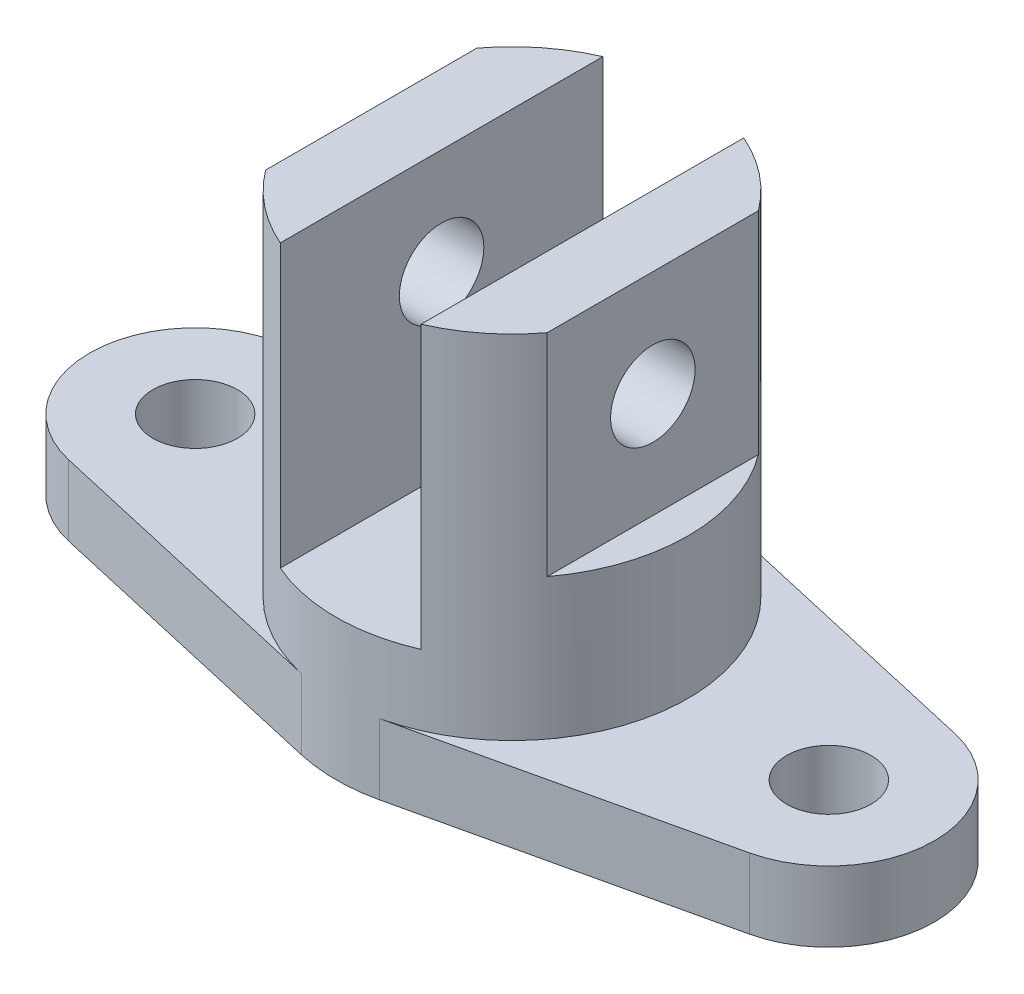
ISO-10303-21;
HEADER;
FILE_DESCRIPTION(('STEP AP214'),'2;1');
FILE_NAME('part.step','',(''),(''),'','','');
FILE_SCHEMA(('AUTOMOTIVE_DESIGN { 1 0 10303 214 1 1 1 1 }'));
ENDSEC;
DATA;
#1=APPLICATION_CONTEXT('core data for automotive mechanical design processes');
#2=APPLICATION_PROTOCOL_DEFINITION('international standard','automotive_design',2000,#1);
#3=PRODUCT_CONTEXT('',#1,'mechanical');
#4=PRODUCT('Part','Part','',(#3));
#5=PRODUCT_RELATED_PRODUCT_CATEGORY('part','',(#4));
#6=PRODUCT_DEFINITION_FORMATION('','',#4);
#7=PRODUCT_DEFINITION_CONTEXT('part definition',#1,'design');
#8=PRODUCT_DEFINITION('design','',#6,#7);
#9=PRODUCT_DEFINITION_SHAPE('','',#8);
#10=(LENGTH_UNIT() NAMED_UNIT(*) SI_UNIT(.MILLI.,.METRE.));
#11=(NAMED_UNIT(*) PLANE_ANGLE_UNIT() SI_UNIT($,.RADIAN.));
#12=(NAMED_UNIT(*) SI_UNIT($,.STERADIAN.) SOLID_ANGLE_UNIT());
#13=UNCERTAINTY_MEASURE_WITH_UNIT(LENGTH_MEASURE(1.E-05),#10,'distance_accuracy_value','');
#14=(GEOMETRIC_REPRESENTATION_CONTEXT(3) GLOBAL_UNCERTAINTY_ASSIGNED_CONTEXT((#13)) GLOBAL_UNIT_ASSIGNED_CONTEXT((#10,
#11,#12)) REPRESENTATION_CONTEXT('',''));
#15=CARTESIAN_POINT('',(0.,0.,0.));
#16=DIRECTION('',(0.,0.,1.));
#17=DIRECTION('',(1.,0.,0.));
#18=AXIS2_PLACEMENT_3D('',#15,#16,#17);
#19=CARTESIAN_POINT('',(0.,60.,0.));
#20=DIRECTION('',(0.,1.,0.));
#21=DIRECTION('',(0.,0.,1.));
#22=AXIS2_PLACEMENT_3D('',#19,#20,#21);
#23=PLANE('',#22);
#24=DIRECTION('',(0.,0.,1.));
#25=VECTOR('',#24,1.);
#26=CARTESIAN_POINT('',(20.,60.,-25.));
#27=LINE('',#26,#25);
#28=CARTESIAN_POINT('',(20.,60.,-15.));
#29=VERTEX_POINT('',#28);
#30=CARTESIAN_POINT('',(20.,60.,15.));
#31=VERTEX_POINT('',#30);
#32=EDGE_CURVE('E259',#29,#31,#27,.T.);
#33=ORIENTED_EDGE('',*,*,#32,.F.);
#34=CARTESIAN_POINT('',(0.,60.,0.));
#35=DIRECTION('',(0.,1.,0.));
#36=DIRECTION('',(0.,0.,1.));
#37=AXIS2_PLACEMENT_3D('',#34,#35,#36);
#38=CIRCLE('',#37,25.);
#39=CARTESIAN_POINT('',(10.,60.,-22.9128784747792));
#40=VERTEX_POINT('',#39);
#41=EDGE_CURVE('E182',#29,#40,#38,.T.);
#42=ORIENTED_EDGE('',*,*,#41,.T.);
#43=DIRECTION('',(0.,0.,-1.));
#44=VECTOR('',#43,1.);
#45=CARTESIAN_POINT('',(10.,60.,0.));
#46=LINE('',#45,#44);
#47=CARTESIAN_POINT('',(10.,60.,22.9128784747792));
#48=VERTEX_POINT('',#47);
#49=EDGE_CURVE('E237',#48,#40,#46,.T.);
#50=ORIENTED_EDGE('',*,*,#49,.F.);
#51=EDGE_CURVE('E185',#48,#31,#38,.T.);
#52=ORIENTED_EDGE('',*,*,#51,.T.);
#53=EDGE_LOOP('',(#33,#42,#50,#52));
#54=FACE_BOUND('',#53,.T.);
#55=ADVANCED_FACE('F44',(#54),#23,.T.);
#56=CARTESIAN_POINT('',(5.55555555555555,10.,24.3749010760892));
#57=DIRECTION('',(0.222222222222222,0.,0.974996043043569));
#58=DIRECTION('',(0.974996043043569,0.,-0.222222222222222));
#59=AXIS2_PLACEMENT_3D('',#56,#57,#58);
#60=PLANE('',#59);
#61=DIRECTION('',(-0.974996043043569,0.,0.222222222222222));
#62=VECTOR('',#61,1.);
#63=CARTESIAN_POINT('',(5.55555555555555,0.,24.3749010760892));
#64=LINE('',#63,#62);
#65=CARTESIAN_POINT('',(48.3333333333333,0.,14.6249406456535));
#66=VERTEX_POINT('',#65);
#67=CARTESIAN_POINT('',(5.55555555555555,0.,24.3749010760892));
#68=VERTEX_POINT('',#67);
#69=EDGE_CURVE('E200',#66,#68,#64,.T.);
#70=ORIENTED_EDGE('',*,*,#69,.F.);
#71=DIRECTION('',(0.,-1.,0.));
#72=VECTOR('',#71,1.);
#73=CARTESIAN_POINT('',(48.3333333333333,10.,14.6249406456535));
#74=LINE('',#73,#72);
#75=CARTESIAN_POINT('',(48.3333333333333,10.,14.6249406456535));
#76=VERTEX_POINT('',#75);
#77=EDGE_CURVE('E232',#76,#66,#74,.T.);
#78=ORIENTED_EDGE('',*,*,#77,.F.);
#79=DIRECTION('',(-0.974996043043569,0.,0.222222222222222));
#80=VECTOR('',#79,1.);
#81=CARTESIAN_POINT('',(5.55555555555555,10.,24.3749010760892));
#82=LINE('',#81,#80);
#83=CARTESIAN_POINT('',(5.55555555555555,10.,24.3749010760892));
#84=VERTEX_POINT('',#83);
#85=EDGE_CURVE('E351',#76,#84,#82,.T.);
#86=ORIENTED_EDGE('',*,*,#85,.T.);
#87=DIRECTION('',(0.,-1.,0.));
#88=VECTOR('',#87,1.);
#89=CARTESIAN_POINT('',(5.55555555555555,10.,24.3749010760892));
#90=LINE('',#89,#88);
#91=EDGE_CURVE('E220',#84,#68,#90,.T.);
#92=ORIENTED_EDGE('',*,*,#91,.T.);
#93=EDGE_LOOP('',(#70,#78,#86,#92));
#94=FACE_BOUND('',#93,.T.);
#95=ADVANCED_FACE('F371',(#94),#60,.T.);
#96=CARTESIAN_POINT('',(45.,10.,0.));
#97=DIRECTION('',(0.,-1.,0.));
#98=DIRECTION('',(0.,0.,-1.));
#99=AXIS2_PLACEMENT_3D('',#96,#97,#98);
#100=CYLINDRICAL_SURFACE('',#99,15.);
#101=CARTESIAN_POINT('',(45.,0.,0.));
#102=DIRECTION('',(0.,1.,0.));
#103=DIRECTION('',(0.,0.,1.));
#104=AXIS2_PLACEMENT_3D('',#101,#102,#103);
#105=CIRCLE('',#104,15.);
#106=CARTESIAN_POINT('',(48.3333333333333,0.,-14.6249406456535));
#107=VERTEX_POINT('',#106);
#108=EDGE_CURVE('E206',#66,#107,#105,.T.);
#109=ORIENTED_EDGE('',*,*,#108,.T.);
#110=DIRECTION('',(0.,-1.,0.));
#111=VECTOR('',#110,1.);
#112=CARTESIAN_POINT('',(48.3333333333333,10.,-14.6249406456535));
#113=LINE('',#112,#111);
#114=CARTESIAN_POINT('',(48.3333333333333,10.,-14.6249406456535));
#115=VERTEX_POINT('',#114);
#116=EDGE_CURVE('E228',#115,#107,#113,.T.);
#117=ORIENTED_EDGE('',*,*,#116,.F.);
#118=CARTESIAN_POINT('',(45.,10.,0.));
#119=DIRECTION('',(0.,1.,0.));
#120=DIRECTION('',(0.,0.,1.));
#121=AXIS2_PLACEMENT_3D('',#118,#119,#120);
#122=CIRCLE('',#121,15.);
#123=EDGE_CURVE('E355',#76,#115,#122,.T.);
#124=ORIENTED_EDGE('',*,*,#123,.F.);
#125=ORIENTED_EDGE('',*,*,#77,.T.);
#126=EDGE_LOOP('',(#109,#117,#124,#125));
#127=FACE_BOUND('',#126,.T.);
#128=ADVANCED_FACE('F374',(#127),#100,.T.);
#129=CARTESIAN_POINT('',(5.55555555555555,10.,-24.3749010760892));
#130=DIRECTION('',(-0.222222222222222,0.,0.974996043043569));
#131=DIRECTION('',(0.974996043043569,0.,0.222222222222222));
#132=AXIS2_PLACEMENT_3D('',#129,#130,#131);
#133=PLANE('',#132);
#134=DIRECTION('',(-0.974996043043569,0.,-0.222222222222222));
#135=VECTOR('',#134,1.);
#136=CARTESIAN_POINT('',(5.55555555555555,0.,-24.3749010760892));
#137=LINE('',#136,#135);
#138=CARTESIAN_POINT('',(5.55555555555556,0.,-24.3749010760892));
#139=VERTEX_POINT('',#138);
#140=EDGE_CURVE('E215',#107,#139,#137,.T.);
#141=ORIENTED_EDGE('',*,*,#140,.T.);
#142=DIRECTION('',(0.,-1.,0.));
#143=VECTOR('',#142,1.);
#144=CARTESIAN_POINT('',(5.55555555555556,10.,-24.3749010760892));
#145=LINE('',#144,#143);
#146=CARTESIAN_POINT('',(5.55555555555555,10.,-24.3749010760892));
#147=VERTEX_POINT('',#146);
#148=EDGE_CURVE('E224',#147,#139,#145,.T.);
#149=ORIENTED_EDGE('',*,*,#148,.F.);
#150=DIRECTION('',(-0.974996043043569,0.,-0.222222222222222));
#151=VECTOR('',#150,1.);
#152=CARTESIAN_POINT('',(5.55555555555555,10.,-24.3749010760892));
#153=LINE('',#152,#151);
#154=EDGE_CURVE('E358',#115,#147,#153,.T.);
#155=ORIENTED_EDGE('',*,*,#154,.F.);
#156=ORIENTED_EDGE('',*,*,#116,.T.);
#157=EDGE_LOOP('',(#141,#149,#155,#156));
#158=FACE_BOUND('',#157,.T.);
#159=ADVANCED_FACE('F376',(#158),#133,.F.);
#160=CARTESIAN_POINT('',(45.,10.,0.));
#161=DIRECTION('',(0.,-1.,0.));
#162=DIRECTION('',(0.,0.,-1.));
#163=AXIS2_PLACEMENT_3D('',#160,#161,#162);
#164=CYLINDRICAL_SURFACE('',#163,6.);
#165=CARTESIAN_POINT('',(45.,10.,0.));
#166=DIRECTION('',(0.,1.,0.));
#167=DIRECTION('',(0.,0.,1.));
#168=AXIS2_PLACEMENT_3D('',#165,#166,#167);
#169=CIRCLE('',#168,6.);
#170=CARTESIAN_POINT('',(45.,10.,6.00000000000001));
#171=VERTEX_POINT('',#170);
#172=EDGE_CURVE('E219',#171,#171,#169,.F.);
#173=ORIENTED_EDGE('',*,*,#172,.F.);
#174=EDGE_LOOP('',(#173));
#175=FACE_BOUND('',#174,.T.);
#176=CARTESIAN_POINT('',(45.,0.,0.));
#177=DIRECTION('',(0.,1.,0.));
#178=DIRECTION('',(0.,0.,1.));
#179=AXIS2_PLACEMENT_3D('',#176,#177,#178);
#180=CIRCLE('',#179,6.);
#181=CARTESIAN_POINT('',(45.,0.,6.00000000000001));
#182=VERTEX_POINT('',#181);
#183=EDGE_CURVE('E193',#182,#182,#180,.F.);
#184=ORIENTED_EDGE('',*,*,#183,.T.);
#185=EDGE_LOOP('',(#184));
#186=FACE_BOUND('',#185,.T.);
#187=ADVANCED_FACE('F46',(#175,#186),#164,.F.);
#188=CARTESIAN_POINT('',(0.,10.,0.));
#189=DIRECTION('',(0.,1.,0.));
#190=DIRECTION('',(0.,0.,1.));
#191=AXIS2_PLACEMENT_3D('',#188,#189,#190);
#192=PLANE('',#191);
#193=ORIENTED_EDGE('',*,*,#172,.T.);
#194=EDGE_LOOP('',(#193));
#195=FACE_BOUND('',#194,.T.);
#196=ORIENTED_EDGE('',*,*,#85,.F.);
#197=ORIENTED_EDGE('',*,*,#123,.T.);
#198=ORIENTED_EDGE('',*,*,#154,.T.);
#199=CARTESIAN_POINT('',(0.,10.,0.));
#200=DIRECTION('',(0.,1.,0.));
#201=DIRECTION('',(0.,0.,1.));
#202=AXIS2_PLACEMENT_3D('',#199,#200,#201);
#203=CIRCLE('',#202,25.);
#204=EDGE_CURVE('E209',#84,#147,#203,.T.);
#205=ORIENTED_EDGE('',*,*,#204,.F.);
#206=EDGE_LOOP('',(#196,#197,#198,#205));
#207=FACE_BOUND('',#206,.T.);
#208=ADVANCED_FACE('F366',(#195,#207),#192,.T.);
#209=CARTESIAN_POINT('',(0.,0.,0.));
#210=DIRECTION('',(0.,1.,0.));
#211=DIRECTION('',(0.,0.,1.));
#212=AXIS2_PLACEMENT_3D('',#209,#210,#211);
#213=PLANE('',#212);
#214=ORIENTED_EDGE('',*,*,#183,.F.);
#215=EDGE_LOOP('',(#214));
#216=FACE_BOUND('',#215,.T.);
#217=ORIENTED_EDGE('',*,*,#69,.T.);
#218=CARTESIAN_POINT('',(0.,0.,0.));
#219=DIRECTION('',(0.,1.,0.));
#220=DIRECTION('',(0.,0.,1.));
#221=AXIS2_PLACEMENT_3D('',#218,#219,#220);
#222=CIRCLE('',#221,25.);
#223=CARTESIAN_POINT('',(-5.55555555555555,0.,24.3749010760892));
#224=VERTEX_POINT('',#223);
#225=EDGE_CURVE('E341',#224,#68,#222,.T.);
#226=ORIENTED_EDGE('',*,*,#225,.F.);
#227=DIRECTION('',(0.974996043043569,0.,0.222222222222222));
#228=VECTOR('',#227,1.);
#229=CARTESIAN_POINT('',(-5.55555555555555,0.,24.3749010760892));
#230=LINE('',#229,#228);
#231=CARTESIAN_POINT('',(-48.3333333333333,0.,14.6249406456535));
#232=VERTEX_POINT('',#231);
#233=EDGE_CURVE('E319',#232,#224,#230,.T.);
#234=ORIENTED_EDGE('',*,*,#233,.F.);
#235=CARTESIAN_POINT('',(-45.,0.,0.));
#236=DIRECTION('',(0.,1.,0.));
#237=DIRECTION('',(0.,0.,1.));
#238=AXIS2_PLACEMENT_3D('',#235,#236,#237);
#239=CIRCLE('',#238,15.);
#240=CARTESIAN_POINT('',(-48.3333333333333,0.,-14.6249406456535));
#241=VERTEX_POINT('',#240);
#242=EDGE_CURVE('E294',#232,#241,#239,.F.);
#243=ORIENTED_EDGE('',*,*,#242,.T.);
#244=DIRECTION('',(0.974996043043569,0.,-0.222222222222222));
#245=VECTOR('',#244,1.);
#246=CARTESIAN_POINT('',(-5.55555555555555,0.,-24.3749010760892));
#247=LINE('',#246,#245);
#248=CARTESIAN_POINT('',(-5.55555555555555,0.,-24.3749010760892));
#249=VERTEX_POINT('',#248);
#250=EDGE_CURVE('E323',#241,#249,#247,.T.);
#251=ORIENTED_EDGE('',*,*,#250,.T.);
#252=EDGE_CURVE('E188',#139,#249,#222,.T.);
#253=ORIENTED_EDGE('',*,*,#252,.F.);
#254=ORIENTED_EDGE('',*,*,#140,.F.);
#255=ORIENTED_EDGE('',*,*,#108,.F.);
#256=EDGE_LOOP('',(#217,#226,#234,#243,#251,#253,#254,#255));
#257=FACE_BOUND('',#256,.T.);
#258=CARTESIAN_POINT('',(-45.,0.,0.));
#259=DIRECTION('',(0.,1.,0.));
#260=DIRECTION('',(0.,0.,1.));
#261=AXIS2_PLACEMENT_3D('',#258,#259,#260);
#262=CIRCLE('',#261,6.);
#263=CARTESIAN_POINT('',(-45.,0.,6.00000000000001));
#264=VERTEX_POINT('',#263);
#265=EDGE_CURVE('E300',#264,#264,#262,.T.);
#266=ORIENTED_EDGE('',*,*,#265,.T.);
#267=EDGE_LOOP('',(#266));
#268=FACE_BOUND('',#267,.T.);
#269=ADVANCED_FACE('F378',(#216,#257,#268),#213,.F.);
#270=CARTESIAN_POINT('',(0.,60.,0.));
#271=DIRECTION('',(0.,-1.,0.));
#272=DIRECTION('',(0.,0.,-1.));
#273=AXIS2_PLACEMENT_3D('',#270,#271,#272);
#274=CYLINDRICAL_SURFACE('',#273,25.);
#275=CARTESIAN_POINT('',(-20.,60.,15.));
#276=VERTEX_POINT('',#275);
#277=CARTESIAN_POINT('',(-10.,60.,22.9128784747792));
#278=VERTEX_POINT('',#277);
#279=EDGE_CURVE('E183',#276,#278,#38,.T.);
#280=ORIENTED_EDGE('',*,*,#279,.F.);
#281=DIRECTION('',(0.,-1.,0.));
#282=VECTOR('',#281,1.);
#283=CARTESIAN_POINT('',(-20.,60.,15.));
#284=LINE('',#283,#282);
#285=CARTESIAN_POINT('',(-20.,30.,15.));
#286=VERTEX_POINT('',#285);
#287=EDGE_CURVE('E61',#276,#286,#284,.T.);
#288=ORIENTED_EDGE('',*,*,#287,.T.);
#289=CARTESIAN_POINT('',(0.,30.,0.));
#290=DIRECTION('',(0.,-1.,0.));
#291=DIRECTION('',(0.,0.,-1.));
#292=AXIS2_PLACEMENT_3D('',#289,#290,#291);
#293=CIRCLE('',#292,25.);
#294=CARTESIAN_POINT('',(-20.,30.,-15.));
#295=VERTEX_POINT('',#294);
#296=EDGE_CURVE('E11',#286,#295,#293,.T.);
#297=ORIENTED_EDGE('',*,*,#296,.T.);
#298=DIRECTION('',(0.,-1.,0.));
#299=VECTOR('',#298,1.);
#300=CARTESIAN_POINT('',(-20.,60.,-15.));
#301=LINE('',#300,#299);
#302=CARTESIAN_POINT('',(-20.,60.,-15.));
#303=VERTEX_POINT('',#302);
#304=EDGE_CURVE('E162',#295,#303,#301,.F.);
#305=ORIENTED_EDGE('',*,*,#304,.T.);
#306=CARTESIAN_POINT('',(-10.,60.,-22.9128784747792));
#307=VERTEX_POINT('',#306);
#308=EDGE_CURVE('E175',#307,#303,#38,.T.);
#309=ORIENTED_EDGE('',*,*,#308,.F.);
#310=DIRECTION('',(0.,-1.,0.));
#311=VECTOR('',#310,1.);
#312=CARTESIAN_POINT('',(-10.,60.,-22.9128784747792));
#313=LINE('',#312,#311);
#314=CARTESIAN_POINT('',(-10.,20.,-22.9128784747792));
#315=VERTEX_POINT('',#314);
#316=EDGE_CURVE('E69',#307,#315,#313,.T.);
#317=ORIENTED_EDGE('',*,*,#316,.T.);
#318=CARTESIAN_POINT('',(0.,20.,0.));
#319=DIRECTION('',(0.,-1.,0.));
#320=DIRECTION('',(0.,0.,-1.));
#321=AXIS2_PLACEMENT_3D('',#318,#319,#320);
#322=CIRCLE('',#321,25.);
#323=CARTESIAN_POINT('',(10.,20.,-22.9128784747792));
#324=VERTEX_POINT('',#323);
#325=EDGE_CURVE('E241',#315,#324,#322,.T.);
#326=ORIENTED_EDGE('',*,*,#325,.T.);
#327=DIRECTION('',(0.,-1.,0.));
#328=VECTOR('',#327,1.);
#329=CARTESIAN_POINT('',(10.,60.,-22.9128784747792));
#330=LINE('',#329,#328);
#331=EDGE_CURVE('E287',#324,#40,#330,.F.);
#332=ORIENTED_EDGE('',*,*,#331,.T.);
#333=ORIENTED_EDGE('',*,*,#41,.F.);
#334=DIRECTION('',(0.,-1.,0.));
#335=VECTOR('',#334,1.);
#336=CARTESIAN_POINT('',(20.,60.,-15.));
#337=LINE('',#336,#335);
#338=CARTESIAN_POINT('',(20.,30.,-15.));
#339=VERTEX_POINT('',#338);
#340=EDGE_CURVE('E54',#29,#339,#337,.T.);
#341=ORIENTED_EDGE('',*,*,#340,.T.);
#342=CARTESIAN_POINT('',(0.,30.,0.));
#343=DIRECTION('',(0.,1.,0.));
#344=DIRECTION('',(0.,0.,1.));
#345=AXIS2_PLACEMENT_3D('',#342,#343,#344);
#346=CIRCLE('',#345,25.);
#347=CARTESIAN_POINT('',(20.,30.,15.));
#348=VERTEX_POINT('',#347);
#349=EDGE_CURVE('E168',#348,#339,#346,.T.);
#350=ORIENTED_EDGE('',*,*,#349,.F.);
#351=DIRECTION('',(0.,-1.,0.));
#352=VECTOR('',#351,1.);
#353=CARTESIAN_POINT('',(20.,60.,15.));
#354=LINE('',#353,#352);
#355=EDGE_CURVE('E247',#348,#31,#354,.F.);
#356=ORIENTED_EDGE('',*,*,#355,.T.);
#357=ORIENTED_EDGE('',*,*,#51,.F.);
#358=DIRECTION('',(0.,-1.,0.));
#359=VECTOR('',#358,1.);
#360=CARTESIAN_POINT('',(10.,60.,22.9128784747792));
#361=LINE('',#360,#359);
#362=CARTESIAN_POINT('',(10.,20.,22.9128784747792));
#363=VERTEX_POINT('',#362);
#364=EDGE_CURVE('E290',#48,#363,#361,.T.);
#365=ORIENTED_EDGE('',*,*,#364,.T.);
#366=CARTESIAN_POINT('',(-10.,20.,22.9128784747792));
#367=VERTEX_POINT('',#366);
#368=EDGE_CURVE('E169',#363,#367,#322,.T.);
#369=ORIENTED_EDGE('',*,*,#368,.T.);
#370=DIRECTION('',(0.,-1.,0.));
#371=VECTOR('',#370,1.);
#372=CARTESIAN_POINT('',(-10.,60.,22.9128784747792));
#373=LINE('',#372,#371);
#374=EDGE_CURVE('E281',#367,#278,#373,.F.);
#375=ORIENTED_EDGE('',*,*,#374,.T.);
#376=EDGE_LOOP('',(#280,#288,#297,#305,#309,#317,#326,#332,#333,#341,#350,#356,#357,#365,#369,#375));
#377=FACE_BOUND('',#376,.T.);
#378=CARTESIAN_POINT('',(0.,10.,0.));
#379=DIRECTION('',(0.,1.,0.));
#380=DIRECTION('',(0.,0.,1.));
#381=AXIS2_PLACEMENT_3D('',#378,#379,#380);
#382=CIRCLE('',#381,25.);
#383=CARTESIAN_POINT('',(-5.55555555555556,10.,-24.3749010760892));
#384=VERTEX_POINT('',#383);
#385=CARTESIAN_POINT('',(-5.55555555555555,10.,24.3749010760892));
#386=VERTEX_POINT('',#385);
#387=EDGE_CURVE('E304',#384,#386,#382,.T.);
#388=ORIENTED_EDGE('',*,*,#387,.T.);
#389=DIRECTION('',(0.,-1.,0.));
#390=VECTOR('',#389,1.);
#391=CARTESIAN_POINT('',(-5.55555555555555,10.,24.3749010760892));
#392=LINE('',#391,#390);
#393=EDGE_CURVE('E336',#386,#224,#392,.T.);
#394=ORIENTED_EDGE('',*,*,#393,.T.);
#395=ORIENTED_EDGE('',*,*,#225,.T.);
#396=ORIENTED_EDGE('',*,*,#91,.F.);
#397=ORIENTED_EDGE('',*,*,#204,.T.);
#398=ORIENTED_EDGE('',*,*,#148,.T.);
#399=ORIENTED_EDGE('',*,*,#252,.T.);
#400=DIRECTION('',(0.,-1.,0.));
#401=VECTOR('',#400,1.);
#402=CARTESIAN_POINT('',(-5.55555555555556,10.,-24.3749010760892));
#403=LINE('',#402,#401);
#404=EDGE_CURVE('E332',#384,#249,#403,.T.);
#405=ORIENTED_EDGE('',*,*,#404,.F.);
#406=EDGE_LOOP('',(#388,#394,#395,#396,#397,#398,#399,#405));
#407=FACE_BOUND('',#406,.T.);
#408=ADVANCED_FACE('F173',(#377,#407),#274,.T.);
#409=DIRECTION('',(0.,0.,-1.));
#410=VECTOR('',#409,1.);
#411=CARTESIAN_POINT('',(-20.,60.,0.));
#412=LINE('',#411,#410);
#413=EDGE_CURVE('E159',#276,#303,#412,.T.);
#414=ORIENTED_EDGE('',*,*,#413,.F.);
#415=ORIENTED_EDGE('',*,*,#279,.T.);
#416=DIRECTION('',(0.,0.,1.));
#417=VECTOR('',#416,1.);
#418=CARTESIAN_POINT('',(-10.,60.,0.));
#419=LINE('',#418,#417);
#420=EDGE_CURVE('E180',#307,#278,#419,.T.);
#421=ORIENTED_EDGE('',*,*,#420,.F.);
#422=ORIENTED_EDGE('',*,*,#308,.T.);
#423=EDGE_LOOP('',(#414,#415,#421,#422));
#424=FACE_BOUND('',#423,.T.);
#425=ADVANCED_FACE('F179',(#424),#23,.T.);
#426=CARTESIAN_POINT('',(-45.,10.,0.));
#427=DIRECTION('',(0.,-1.,0.));
#428=DIRECTION('',(0.,0.,-1.));
#429=AXIS2_PLACEMENT_3D('',#426,#427,#428);
#430=CYLINDRICAL_SURFACE('',#429,15.);
#431=ORIENTED_EDGE('',*,*,#242,.F.);
#432=DIRECTION('',(0.,-1.,0.));
#433=VECTOR('',#432,1.);
#434=CARTESIAN_POINT('',(-48.3333333333333,10.,14.6249406456535));
#435=LINE('',#434,#433);
#436=CARTESIAN_POINT('',(-48.3333333333333,10.,14.6249406456535));
#437=VERTEX_POINT('',#436);
#438=EDGE_CURVE('E339',#437,#232,#435,.T.);
#439=ORIENTED_EDGE('',*,*,#438,.F.);
#440=CARTESIAN_POINT('',(-45.,10.,0.));
#441=DIRECTION('',(0.,1.,0.));
#442=DIRECTION('',(0.,0.,1.));
#443=AXIS2_PLACEMENT_3D('',#440,#441,#442);
#444=CIRCLE('',#443,15.);
#445=CARTESIAN_POINT('',(-48.3333333333333,10.,-14.6249406456535));
#446=VERTEX_POINT('',#445);
#447=EDGE_CURVE('E295',#437,#446,#444,.F.);
#448=ORIENTED_EDGE('',*,*,#447,.T.);
#449=DIRECTION('',(0.,-1.,0.));
#450=VECTOR('',#449,1.);
#451=CARTESIAN_POINT('',(-48.3333333333333,10.,-14.6249406456535));
#452=LINE('',#451,#450);
#453=EDGE_CURVE('E315',#446,#241,#452,.T.);
#454=ORIENTED_EDGE('',*,*,#453,.T.);
#455=EDGE_LOOP('',(#431,#439,#448,#454));
#456=FACE_BOUND('',#455,.T.);
#457=ADVANCED_FACE('F393',(#456),#430,.T.);
#458=CARTESIAN_POINT('',(-5.55555555555555,10.,24.3749010760892));
#459=DIRECTION('',(0.222222222222222,0.,-0.974996043043569));
#460=DIRECTION('',(-0.974996043043569,0.,-0.222222222222222));
#461=AXIS2_PLACEMENT_3D('',#458,#459,#460);
#462=PLANE('',#461);
#463=ORIENTED_EDGE('',*,*,#233,.T.);
#464=ORIENTED_EDGE('',*,*,#393,.F.);
#465=DIRECTION('',(0.974996043043569,0.,0.222222222222222));
#466=VECTOR('',#465,1.);
#467=CARTESIAN_POINT('',(-5.55555555555555,10.,24.3749010760892));
#468=LINE('',#467,#466);
#469=EDGE_CURVE('E299',#437,#386,#468,.T.);
#470=ORIENTED_EDGE('',*,*,#469,.F.);
#471=ORIENTED_EDGE('',*,*,#438,.T.);
#472=EDGE_LOOP('',(#463,#464,#470,#471));
#473=FACE_BOUND('',#472,.T.);
#474=ADVANCED_FACE('F390',(#473),#462,.F.);
#475=CARTESIAN_POINT('',(-5.55555555555555,10.,-24.3749010760892));
#476=DIRECTION('',(-0.222222222222222,0.,-0.974996043043569));
#477=DIRECTION('',(-0.974996043043569,0.,0.222222222222222));
#478=AXIS2_PLACEMENT_3D('',#475,#476,#477);
#479=PLANE('',#478);
#480=ORIENTED_EDGE('',*,*,#250,.F.);
#481=ORIENTED_EDGE('',*,*,#453,.F.);
#482=DIRECTION('',(0.974996043043569,0.,-0.222222222222222));
#483=VECTOR('',#482,1.);
#484=CARTESIAN_POINT('',(-5.55555555555555,10.,-24.3749010760892));
#485=LINE('',#484,#483);
#486=EDGE_CURVE('E307',#446,#384,#485,.T.);
#487=ORIENTED_EDGE('',*,*,#486,.T.);
#488=ORIENTED_EDGE('',*,*,#404,.T.);
#489=EDGE_LOOP('',(#480,#481,#487,#488));
#490=FACE_BOUND('',#489,.T.);
#491=ADVANCED_FACE('F383',(#490),#479,.T.);
#492=CARTESIAN_POINT('',(-45.,10.,0.));
#493=DIRECTION('',(0.,-1.,0.));
#494=DIRECTION('',(0.,0.,-1.));
#495=AXIS2_PLACEMENT_3D('',#492,#493,#494);
#496=CYLINDRICAL_SURFACE('',#495,6.);
#497=CARTESIAN_POINT('',(-45.,10.,0.));
#498=DIRECTION('',(0.,1.,0.));
#499=DIRECTION('',(0.,0.,1.));
#500=AXIS2_PLACEMENT_3D('',#497,#498,#499);
#501=CIRCLE('',#500,6.);
#502=CARTESIAN_POINT('',(-45.,10.,6.00000000000001));
#503=VERTEX_POINT('',#502);
#504=EDGE_CURVE('E311',#503,#503,#501,.T.);
#505=ORIENTED_EDGE('',*,*,#504,.T.);
#506=EDGE_LOOP('',(#505));
#507=FACE_BOUND('',#506,.T.);
#508=ORIENTED_EDGE('',*,*,#265,.F.);
#509=EDGE_LOOP('',(#508));
#510=FACE_BOUND('',#509,.T.);
#511=ADVANCED_FACE('F566',(#507,#510),#496,.F.);
#512=CARTESIAN_POINT('',(0.,10.,0.));
#513=DIRECTION('',(0.,1.,0.));
#514=DIRECTION('',(0.,0.,1.));
#515=AXIS2_PLACEMENT_3D('',#512,#513,#514);
#516=PLANE('',#515);
#517=ORIENTED_EDGE('',*,*,#447,.F.);
#518=ORIENTED_EDGE('',*,*,#469,.T.);
#519=ORIENTED_EDGE('',*,*,#387,.F.);
#520=ORIENTED_EDGE('',*,*,#486,.F.);
#521=EDGE_LOOP('',(#517,#518,#519,#520));
#522=FACE_BOUND('',#521,.T.);
#523=ORIENTED_EDGE('',*,*,#504,.F.);
#524=EDGE_LOOP('',(#523));
#525=FACE_BOUND('',#524,.T.);
#526=ADVANCED_FACE('F387',(#522,#525),#516,.T.);
#527=CARTESIAN_POINT('',(0.,20.,0.));
#528=DIRECTION('',(0.,-1.,0.));
#529=DIRECTION('',(0.,0.,-1.));
#530=AXIS2_PLACEMENT_3D('',#527,#528,#529);
#531=PLANE('',#530);
#532=DIRECTION('',(0.,0.,-1.));
#533=VECTOR('',#532,1.);
#534=CARTESIAN_POINT('',(10.,20.,28.3162679529388));
#535=LINE('',#534,#533);
#536=EDGE_CURVE('E273',#363,#324,#535,.T.);
#537=ORIENTED_EDGE('',*,*,#536,.T.);
#538=ORIENTED_EDGE('',*,*,#325,.F.);
#539=DIRECTION('',(0.,0.,1.));
#540=VECTOR('',#539,1.);
#541=CARTESIAN_POINT('',(-10.,20.,28.3162679529388));
#542=LINE('',#541,#540);
#543=EDGE_CURVE('E277',#315,#367,#542,.T.);
#544=ORIENTED_EDGE('',*,*,#543,.T.);
#545=ORIENTED_EDGE('',*,*,#368,.F.);
#546=EDGE_LOOP('',(#537,#538,#544,#545));
#547=FACE_BOUND('',#546,.T.);
#548=ADVANCED_FACE('F475',(#547),#531,.F.);
#549=CARTESIAN_POINT('',(10.,20.,28.3162679529388));
#550=DIRECTION('',(1.,0.,0.));
#551=DIRECTION('',(0.,0.,-1.));
#552=AXIS2_PLACEMENT_3D('',#549,#550,#551);
#553=PLANE('',#552);
#554=CARTESIAN_POINT('',(10.,45.,0.));
#555=DIRECTION('',(1.,0.,0.));
#556=DIRECTION('',(0.,0.,-1.));
#557=AXIS2_PLACEMENT_3D('',#554,#555,#556);
#558=CIRCLE('',#557,6.);
#559=CARTESIAN_POINT('',(10.,45.,-6.));
#560=VERTEX_POINT('',#559);
#561=EDGE_CURVE('E267',#560,#560,#558,.T.);
#562=ORIENTED_EDGE('',*,*,#561,.T.);
#563=EDGE_LOOP('',(#562));
#564=FACE_BOUND('',#563,.T.);
#565=ORIENTED_EDGE('',*,*,#49,.T.);
#566=ORIENTED_EDGE('',*,*,#331,.F.);
#567=ORIENTED_EDGE('',*,*,#536,.F.);
#568=ORIENTED_EDGE('',*,*,#364,.F.);
#569=EDGE_LOOP('',(#565,#566,#567,#568));
#570=FACE_BOUND('',#569,.T.);
#571=ADVANCED_FACE('F479',(#564,#570),#553,.F.);
#572=CARTESIAN_POINT('',(-10.,20.,28.3162679529388));
#573=DIRECTION('',(-1.,0.,0.));
#574=DIRECTION('',(0.,0.,1.));
#575=AXIS2_PLACEMENT_3D('',#572,#573,#574);
#576=PLANE('',#575);
#577=CARTESIAN_POINT('',(-10.,45.,0.));
#578=DIRECTION('',(-1.,0.,0.));
#579=DIRECTION('',(0.,0.,1.));
#580=AXIS2_PLACEMENT_3D('',#577,#578,#579);
#581=CIRCLE('',#580,6.);
#582=CARTESIAN_POINT('',(-10.,45.,6.));
#583=VERTEX_POINT('',#582);
#584=EDGE_CURVE('E613',#583,#583,#581,.T.);
#585=ORIENTED_EDGE('',*,*,#584,.T.);
#586=EDGE_LOOP('',(#585));
#587=FACE_BOUND('',#586,.T.);
#588=ORIENTED_EDGE('',*,*,#420,.T.);
#589=ORIENTED_EDGE('',*,*,#374,.F.);
#590=ORIENTED_EDGE('',*,*,#543,.F.);
#591=ORIENTED_EDGE('',*,*,#316,.F.);
#592=EDGE_LOOP('',(#588,#589,#590,#591));
#593=FACE_BOUND('',#592,.T.);
#594=ADVANCED_FACE('F493',(#587,#593),#576,.F.);
#595=CARTESIAN_POINT('',(0.,30.,0.));
#596=DIRECTION('',(0.,-1.,0.));
#597=DIRECTION('',(0.,0.,-1.));
#598=AXIS2_PLACEMENT_3D('',#595,#596,#597);
#599=PLANE('',#598);
#600=DIRECTION('',(0.,0.,-1.));
#601=VECTOR('',#600,1.);
#602=CARTESIAN_POINT('',(-20.,30.,-25.));
#603=LINE('',#602,#601);
#604=EDGE_CURVE('E177',#286,#295,#603,.T.);
#605=ORIENTED_EDGE('',*,*,#604,.T.);
#606=ORIENTED_EDGE('',*,*,#296,.F.);
#607=EDGE_LOOP('',(#605,#606));
#608=FACE_BOUND('',#607,.T.);
#609=ADVANCED_FACE('F504',(#608),#599,.F.);
#610=CARTESIAN_POINT('',(-20.,30.,-25.));
#611=DIRECTION('',(1.,0.,0.));
#612=DIRECTION('',(0.,0.,-1.));
#613=AXIS2_PLACEMENT_3D('',#610,#611,#612);
#614=PLANE('',#613);
#615=CARTESIAN_POINT('',(-20.,45.,0.));
#616=DIRECTION('',(1.,0.,0.));
#617=DIRECTION('',(0.,0.,-1.));
#618=AXIS2_PLACEMENT_3D('',#615,#616,#617);
#619=CIRCLE('',#618,6.);
#620=CARTESIAN_POINT('',(-20.,45.,-6.));
#621=VERTEX_POINT('',#620);
#622=EDGE_CURVE('E610',#621,#621,#619,.T.);
#623=ORIENTED_EDGE('',*,*,#622,.T.);
#624=EDGE_LOOP('',(#623));
#625=FACE_BOUND('',#624,.T.);
#626=ORIENTED_EDGE('',*,*,#413,.T.);
#627=ORIENTED_EDGE('',*,*,#304,.F.);
#628=ORIENTED_EDGE('',*,*,#604,.F.);
#629=ORIENTED_EDGE('',*,*,#287,.F.);
#630=EDGE_LOOP('',(#626,#627,#628,#629));
#631=FACE_BOUND('',#630,.T.);
#632=ADVANCED_FACE('F161',(#625,#631),#614,.F.);
#633=CARTESIAN_POINT('',(20.,30.,-25.));
#634=DIRECTION('',(-1.,0.,0.));
#635=DIRECTION('',(0.,0.,1.));
#636=AXIS2_PLACEMENT_3D('',#633,#634,#635);
#637=PLANE('',#636);
#638=CARTESIAN_POINT('',(20.,45.,0.));
#639=DIRECTION('',(-1.,0.,0.));
#640=DIRECTION('',(0.,0.,1.));
#641=AXIS2_PLACEMENT_3D('',#638,#639,#640);
#642=CIRCLE('',#641,6.);
#643=CARTESIAN_POINT('',(20.,45.,6.));
#644=VERTEX_POINT('',#643);
#645=EDGE_CURVE('E48',#644,#644,#642,.T.);
#646=ORIENTED_EDGE('',*,*,#645,.T.);
#647=EDGE_LOOP('',(#646));
#648=FACE_BOUND('',#647,.T.);
#649=ORIENTED_EDGE('',*,*,#32,.T.);
#650=ORIENTED_EDGE('',*,*,#355,.F.);
#651=DIRECTION('',(0.,0.,1.));
#652=VECTOR('',#651,1.);
#653=CARTESIAN_POINT('',(20.,30.,-25.));
#654=LINE('',#653,#652);
#655=EDGE_CURVE('E261',#339,#348,#654,.T.);
#656=ORIENTED_EDGE('',*,*,#655,.F.);
#657=ORIENTED_EDGE('',*,*,#340,.F.);
#658=EDGE_LOOP('',(#649,#650,#656,#657));
#659=FACE_BOUND('',#658,.T.);
#660=ADVANCED_FACE('F258',(#648,#659),#637,.F.);
#661=CARTESIAN_POINT('',(0.,30.,0.));
#662=DIRECTION('',(0.,1.,0.));
#663=DIRECTION('',(0.,0.,1.));
#664=AXIS2_PLACEMENT_3D('',#661,#662,#663);
#665=PLANE('',#664);
#666=ORIENTED_EDGE('',*,*,#655,.T.);
#667=ORIENTED_EDGE('',*,*,#349,.T.);
#668=EDGE_LOOP('',(#666,#667));
#669=FACE_BOUND('',#668,.T.);
#670=ADVANCED_FACE('F531',(#669),#665,.T.);
#671=CARTESIAN_POINT('',(-60.,45.,0.));
#672=DIRECTION('',(1.,0.,0.));
#673=DIRECTION('',(0.,0.,-1.));
#674=AXIS2_PLACEMENT_3D('',#671,#672,#673);
#675=CYLINDRICAL_SURFACE('',#674,6.);
#676=ORIENTED_EDGE('',*,*,#645,.F.);
#677=EDGE_LOOP('',(#676));
#678=FACE_BOUND('',#677,.T.);
#679=ORIENTED_EDGE('',*,*,#561,.F.);
#680=EDGE_LOOP('',(#679));
#681=FACE_BOUND('',#680,.T.);
#682=ADVANCED_FACE('F541',(#678,#681),#675,.F.);
#683=ORIENTED_EDGE('',*,*,#622,.F.);
#684=EDGE_LOOP('',(#683));
#685=FACE_BOUND('',#684,.T.);
#686=ORIENTED_EDGE('',*,*,#584,.F.);
#687=EDGE_LOOP('',(#686));
#688=FACE_BOUND('',#687,.T.);
#689=ADVANCED_FACE('F550',(#685,#688),#675,.F.);
#690=CLOSED_SHELL('',(#55,#95,#128,#159,#187,#208,#269,#408,#425,#457,#474,#491,#511,#526,#548,
#571,#594,#609,#632,#660,#670,#682,#689));
#691=MANIFOLD_SOLID_BREP('B2',#690);
#692=ADVANCED_BREP_SHAPE_REPRESENTATION('',(#18,#691),#14);
#693=SHAPE_DEFINITION_REPRESENTATION(#9,#692);
ENDSEC;
END-ISO-10303-21;
